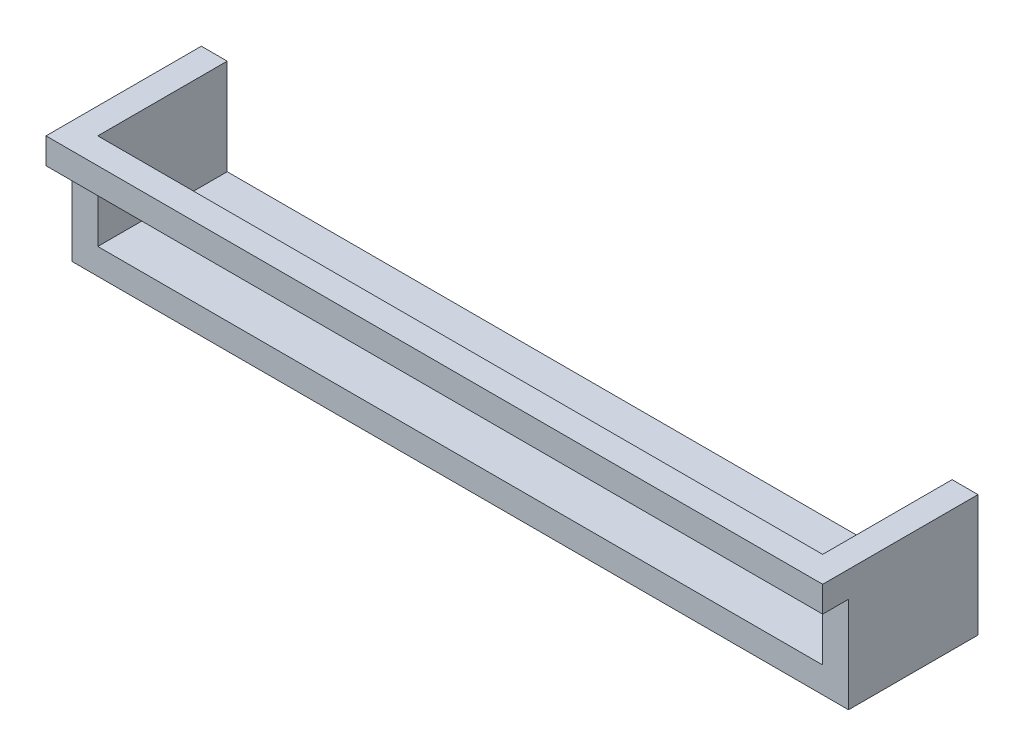
ISO-10303-21;
HEADER;
FILE_DESCRIPTION(('STEP AP214'),'2;1');
FILE_NAME('part.step','',(''),(''),'','','');
FILE_SCHEMA(('AUTOMOTIVE_DESIGN { 1 0 10303 214 1 1 1 1 }'));
ENDSEC;
DATA;
#1=APPLICATION_CONTEXT('core data for automotive mechanical design processes');
#2=APPLICATION_PROTOCOL_DEFINITION('international standard','automotive_design',2000,#1);
#3=PRODUCT_CONTEXT('',#1,'mechanical');
#4=PRODUCT('Part','Part','',(#3));
#5=PRODUCT_RELATED_PRODUCT_CATEGORY('part','',(#4));
#6=PRODUCT_DEFINITION_FORMATION('','',#4);
#7=PRODUCT_DEFINITION_CONTEXT('part definition',#1,'design');
#8=PRODUCT_DEFINITION('design','',#6,#7);
#9=PRODUCT_DEFINITION_SHAPE('','',#8);
#10=(LENGTH_UNIT() NAMED_UNIT(*) SI_UNIT(.MILLI.,.METRE.));
#11=(NAMED_UNIT(*) PLANE_ANGLE_UNIT() SI_UNIT($,.RADIAN.));
#12=(NAMED_UNIT(*) SI_UNIT($,.STERADIAN.) SOLID_ANGLE_UNIT());
#13=UNCERTAINTY_MEASURE_WITH_UNIT(LENGTH_MEASURE(1.E-05),#10,'distance_accuracy_value','');
#14=(GEOMETRIC_REPRESENTATION_CONTEXT(3) GLOBAL_UNCERTAINTY_ASSIGNED_CONTEXT((#13)) GLOBAL_UNIT_ASSIGNED_CONTEXT((#10,
#11,#12)) REPRESENTATION_CONTEXT('',''));
#15=CARTESIAN_POINT('',(0.,0.,0.));
#16=DIRECTION('',(0.,0.,1.));
#17=DIRECTION('',(1.,0.,0.));
#18=AXIS2_PLACEMENT_3D('',#15,#16,#17);
#19=CARTESIAN_POINT('',(-300.,20.,50.0000000000001));
#20=DIRECTION('',(0.,0.,-1.));
#21=DIRECTION('',(-1.,0.,0.));
#22=AXIS2_PLACEMENT_3D('',#19,#20,#21);
#23=PLANE('',#22);
#24=DIRECTION('',(1.,0.,0.));
#25=VECTOR('',#24,1.);
#26=CARTESIAN_POINT('',(-300.,74.,49.9999999999999));
#27=LINE('',#26,#25);
#28=CARTESIAN_POINT('',(-300.,74.,50.0000000000001));
#29=VERTEX_POINT('',#28);
#30=CARTESIAN_POINT('',(-280.,74.,49.9999999999999));
#31=VERTEX_POINT('',#30);
#32=EDGE_CURVE('E49',#29,#31,#27,.T.);
#33=ORIENTED_EDGE('',*,*,#32,.F.);
#34=DIRECTION('',(0.,-1.,0.));
#35=VECTOR('',#34,1.);
#36=CARTESIAN_POINT('',(-300.,20.,50.0000000000001));
#37=LINE('',#36,#35);
#38=CARTESIAN_POINT('',(-300.,0.,50.0000000000001));
#39=VERTEX_POINT('',#38);
#40=EDGE_CURVE('E43',#29,#39,#37,.T.);
#41=ORIENTED_EDGE('',*,*,#40,.T.);
#42=DIRECTION('',(1.,0.,0.));
#43=VECTOR('',#42,1.);
#44=CARTESIAN_POINT('',(-300.,0.,50.0000000000001));
#45=LINE('',#44,#43);
#46=CARTESIAN_POINT('',(300.,0.,49.9999999999999));
#47=VERTEX_POINT('',#46);
#48=EDGE_CURVE('E198',#39,#47,#45,.T.);
#49=ORIENTED_EDGE('',*,*,#48,.T.);
#50=DIRECTION('',(0.,-1.,0.));
#51=VECTOR('',#50,1.);
#52=CARTESIAN_POINT('',(300.,20.,49.9999999999999));
#53=LINE('',#52,#51);
#54=CARTESIAN_POINT('',(300.,74.,49.9999999999999));
#55=VERTEX_POINT('',#54);
#56=EDGE_CURVE('E206',#55,#47,#53,.T.);
#57=ORIENTED_EDGE('',*,*,#56,.F.);
#58=CARTESIAN_POINT('',(280.,74.,49.9999999999999));
#59=VERTEX_POINT('',#58);
#60=EDGE_CURVE('E11',#59,#55,#27,.T.);
#61=ORIENTED_EDGE('',*,*,#60,.F.);
#62=DIRECTION('',(0.,-1.,0.));
#63=VECTOR('',#62,1.);
#64=CARTESIAN_POINT('',(280.,94.,49.9999999999999));
#65=LINE('',#64,#63);
#66=CARTESIAN_POINT('',(280.,20.,49.9999999999999));
#67=VERTEX_POINT('',#66);
#68=EDGE_CURVE('E134',#59,#67,#65,.T.);
#69=ORIENTED_EDGE('',*,*,#68,.T.);
#70=DIRECTION('',(1.,0.,0.));
#71=VECTOR('',#70,1.);
#72=CARTESIAN_POINT('',(-300.,20.,50.0000000000001));
#73=LINE('',#72,#71);
#74=CARTESIAN_POINT('',(-280.,20.,50.0000000000001));
#75=VERTEX_POINT('',#74);
#76=EDGE_CURVE('E189',#75,#67,#73,.T.);
#77=ORIENTED_EDGE('',*,*,#76,.F.);
#78=DIRECTION('',(0.,-1.,0.));
#79=VECTOR('',#78,1.);
#80=CARTESIAN_POINT('',(-280.,94.,50.0000000000001));
#81=LINE('',#80,#79);
#82=EDGE_CURVE('E173',#31,#75,#81,.T.);
#83=ORIENTED_EDGE('',*,*,#82,.F.);
#84=EDGE_LOOP('',(#33,#41,#49,#57,#61,#69,#77,#83));
#85=FACE_BOUND('',#84,.T.);
#86=ADVANCED_FACE('F39',(#85),#23,.F.);
#87=CARTESIAN_POINT('',(0.,20.,0.));
#88=DIRECTION('',(0.,1.,0.));
#89=DIRECTION('',(0.,0.,1.));
#90=AXIS2_PLACEMENT_3D('',#87,#88,#89);
#91=PLANE('',#90);
#92=DIRECTION('',(-1.,0.,0.));
#93=VECTOR('',#92,1.);
#94=CARTESIAN_POINT('',(300.,20.,-50.0000000000001));
#95=LINE('',#94,#93);
#96=CARTESIAN_POINT('',(280.,20.,-50.0000000000001));
#97=VERTEX_POINT('',#96);
#98=CARTESIAN_POINT('',(-280.,20.,-49.9999999999999));
#99=VERTEX_POINT('',#98);
#100=EDGE_CURVE('E192',#97,#99,#95,.T.);
#101=ORIENTED_EDGE('',*,*,#100,.T.);
#102=DIRECTION('',(0.,0.,-1.));
#103=VECTOR('',#102,1.);
#104=CARTESIAN_POINT('',(-280.,20.,0.));
#105=LINE('',#104,#103);
#106=EDGE_CURVE('E160',#75,#99,#105,.T.);
#107=ORIENTED_EDGE('',*,*,#106,.F.);
#108=ORIENTED_EDGE('',*,*,#76,.T.);
#109=DIRECTION('',(0.,0.,1.));
#110=VECTOR('',#109,1.);
#111=CARTESIAN_POINT('',(280.,20.,0.));
#112=LINE('',#111,#110);
#113=EDGE_CURVE('E176',#97,#67,#112,.T.);
#114=ORIENTED_EDGE('',*,*,#113,.F.);
#115=EDGE_LOOP('',(#101,#107,#108,#114));
#116=FACE_BOUND('',#115,.T.);
#117=ADVANCED_FACE('F235',(#116),#91,.T.);
#118=CARTESIAN_POINT('',(-300.,20.,-49.9999999999999));
#119=DIRECTION('',(1.,0.,0.));
#120=DIRECTION('',(0.,0.,-1.));
#121=AXIS2_PLACEMENT_3D('',#118,#119,#120);
#122=PLANE('',#121);
#123=DIRECTION('',(0.,0.,1.));
#124=VECTOR('',#123,1.);
#125=CARTESIAN_POINT('',(-300.,0.,-49.9999999999999));
#126=LINE('',#125,#124);
#127=CARTESIAN_POINT('',(-300.,0.,-49.9999999999999));
#128=VERTEX_POINT('',#127);
#129=EDGE_CURVE('E188',#128,#39,#126,.T.);
#130=ORIENTED_EDGE('',*,*,#129,.T.);
#131=ORIENTED_EDGE('',*,*,#40,.F.);
#132=DIRECTION('',(0.,0.,-1.));
#133=VECTOR('',#132,1.);
#134=CARTESIAN_POINT('',(-300.,74.,69.9999999999999));
#135=LINE('',#134,#133);
#136=CARTESIAN_POINT('',(-300.,74.,69.9999999999999));
#137=VERTEX_POINT('',#136);
#138=EDGE_CURVE('E147',#137,#29,#135,.T.);
#139=ORIENTED_EDGE('',*,*,#138,.F.);
#140=DIRECTION('',(0.,-1.,0.));
#141=VECTOR('',#140,1.);
#142=CARTESIAN_POINT('',(-300.,94.,69.9999999999999));
#143=LINE('',#142,#141);
#144=CARTESIAN_POINT('',(-300.,94.,69.9999999999999));
#145=VERTEX_POINT('',#144);
#146=EDGE_CURVE('E152',#145,#137,#143,.T.);
#147=ORIENTED_EDGE('',*,*,#146,.F.);
#148=DIRECTION('',(0.,0.,1.));
#149=VECTOR('',#148,1.);
#150=CARTESIAN_POINT('',(-300.,94.,0.));
#151=LINE('',#150,#149);
#152=CARTESIAN_POINT('',(-300.,94.,-49.9999999999999));
#153=VERTEX_POINT('',#152);
#154=EDGE_CURVE('E142',#153,#145,#151,.T.);
#155=ORIENTED_EDGE('',*,*,#154,.F.);
#156=DIRECTION('',(0.,-1.,0.));
#157=VECTOR('',#156,1.);
#158=CARTESIAN_POINT('',(-300.,20.,-49.9999999999999));
#159=LINE('',#158,#157);
#160=EDGE_CURVE('E195',#153,#128,#159,.T.);
#161=ORIENTED_EDGE('',*,*,#160,.T.);
#162=EDGE_LOOP('',(#130,#131,#139,#147,#155,#161));
#163=FACE_BOUND('',#162,.T.);
#164=ADVANCED_FACE('F41',(#163),#122,.F.);
#165=CARTESIAN_POINT('',(300.,20.,49.9999999999999));
#166=DIRECTION('',(-1.,0.,0.));
#167=DIRECTION('',(0.,0.,1.));
#168=AXIS2_PLACEMENT_3D('',#165,#166,#167);
#169=PLANE('',#168);
#170=DIRECTION('',(0.,0.,-1.));
#171=VECTOR('',#170,1.);
#172=CARTESIAN_POINT('',(300.,0.,49.9999999999999));
#173=LINE('',#172,#171);
#174=CARTESIAN_POINT('',(300.,0.,-50.0000000000001));
#175=VERTEX_POINT('',#174);
#176=EDGE_CURVE('E201',#47,#175,#173,.T.);
#177=ORIENTED_EDGE('',*,*,#176,.T.);
#178=DIRECTION('',(0.,-1.,0.));
#179=VECTOR('',#178,1.);
#180=CARTESIAN_POINT('',(300.,20.,-50.0000000000001));
#181=LINE('',#180,#179);
#182=CARTESIAN_POINT('',(300.,94.,-50.0000000000001));
#183=VERTEX_POINT('',#182);
#184=EDGE_CURVE('E130',#183,#175,#181,.T.);
#185=ORIENTED_EDGE('',*,*,#184,.F.);
#186=DIRECTION('',(0.,0.,-1.));
#187=VECTOR('',#186,1.);
#188=CARTESIAN_POINT('',(300.,94.,0.));
#189=LINE('',#188,#187);
#190=CARTESIAN_POINT('',(300.,94.,69.9999999999999));
#191=VERTEX_POINT('',#190);
#192=EDGE_CURVE('E122',#191,#183,#189,.T.);
#193=ORIENTED_EDGE('',*,*,#192,.F.);
#194=DIRECTION('',(0.,-1.,0.));
#195=VECTOR('',#194,1.);
#196=CARTESIAN_POINT('',(300.,94.,69.9999999999999));
#197=LINE('',#196,#195);
#198=CARTESIAN_POINT('',(300.,74.,69.9999999999999));
#199=VERTEX_POINT('',#198);
#200=EDGE_CURVE('E127',#191,#199,#197,.T.);
#201=ORIENTED_EDGE('',*,*,#200,.T.);
#202=DIRECTION('',(0.,0.,-1.));
#203=VECTOR('',#202,1.);
#204=CARTESIAN_POINT('',(300.,74.,69.9999999999999));
#205=LINE('',#204,#203);
#206=EDGE_CURVE('E150',#199,#55,#205,.T.);
#207=ORIENTED_EDGE('',*,*,#206,.T.);
#208=ORIENTED_EDGE('',*,*,#56,.T.);
#209=EDGE_LOOP('',(#177,#185,#193,#201,#207,#208));
#210=FACE_BOUND('',#209,.T.);
#211=ADVANCED_FACE('F124',(#210),#169,.F.);
#212=CARTESIAN_POINT('',(300.,20.,-50.0000000000001));
#213=DIRECTION('',(0.,0.,1.));
#214=DIRECTION('',(1.,0.,0.));
#215=AXIS2_PLACEMENT_3D('',#212,#213,#214);
#216=PLANE('',#215);
#217=DIRECTION('',(-1.,0.,0.));
#218=VECTOR('',#217,1.);
#219=CARTESIAN_POINT('',(300.,0.,-50.0000000000001));
#220=LINE('',#219,#218);
#221=EDGE_CURVE('E193',#175,#128,#220,.T.);
#222=ORIENTED_EDGE('',*,*,#221,.T.);
#223=ORIENTED_EDGE('',*,*,#160,.F.);
#224=DIRECTION('',(-1.,0.,0.));
#225=VECTOR('',#224,1.);
#226=CARTESIAN_POINT('',(0.,94.,-50.));
#227=LINE('',#226,#225);
#228=CARTESIAN_POINT('',(-280.,94.,-49.9999999999999));
#229=VERTEX_POINT('',#228);
#230=EDGE_CURVE('E165',#229,#153,#227,.T.);
#231=ORIENTED_EDGE('',*,*,#230,.F.);
#232=DIRECTION('',(0.,-1.,0.));
#233=VECTOR('',#232,1.);
#234=CARTESIAN_POINT('',(-280.,94.,-49.9999999999999));
#235=LINE('',#234,#233);
#236=EDGE_CURVE('E168',#229,#99,#235,.T.);
#237=ORIENTED_EDGE('',*,*,#236,.T.);
#238=ORIENTED_EDGE('',*,*,#100,.F.);
#239=DIRECTION('',(0.,-1.,0.));
#240=VECTOR('',#239,1.);
#241=CARTESIAN_POINT('',(280.,94.,-50.0000000000001));
#242=LINE('',#241,#240);
#243=CARTESIAN_POINT('',(280.,94.,-50.0000000000001));
#244=VERTEX_POINT('',#243);
#245=EDGE_CURVE('E185',#244,#97,#242,.T.);
#246=ORIENTED_EDGE('',*,*,#245,.F.);
#247=DIRECTION('',(-1.,0.,0.));
#248=VECTOR('',#247,1.);
#249=CARTESIAN_POINT('',(0.,94.,-50.));
#250=LINE('',#249,#248);
#251=EDGE_CURVE('E177',#183,#244,#250,.T.);
#252=ORIENTED_EDGE('',*,*,#251,.F.);
#253=ORIENTED_EDGE('',*,*,#184,.T.);
#254=EDGE_LOOP('',(#222,#223,#231,#237,#238,#246,#252,#253));
#255=FACE_BOUND('',#254,.T.);
#256=ADVANCED_FACE('F217',(#255),#216,.F.);
#257=CARTESIAN_POINT('',(0.,0.,0.));
#258=DIRECTION('',(0.,1.,0.));
#259=DIRECTION('',(0.,0.,1.));
#260=AXIS2_PLACEMENT_3D('',#257,#258,#259);
#261=PLANE('',#260);
#262=ORIENTED_EDGE('',*,*,#129,.F.);
#263=ORIENTED_EDGE('',*,*,#221,.F.);
#264=ORIENTED_EDGE('',*,*,#176,.F.);
#265=ORIENTED_EDGE('',*,*,#48,.F.);
#266=EDGE_LOOP('',(#262,#263,#264,#265));
#267=FACE_BOUND('',#266,.T.);
#268=ADVANCED_FACE('F213',(#267),#261,.F.);
#269=CARTESIAN_POINT('',(280.,94.,0.));
#270=DIRECTION('',(1.,0.,0.));
#271=DIRECTION('',(0.,0.,-1.));
#272=AXIS2_PLACEMENT_3D('',#269,#270,#271);
#273=PLANE('',#272);
#274=ORIENTED_EDGE('',*,*,#113,.T.);
#275=ORIENTED_EDGE('',*,*,#68,.F.);
#276=CARTESIAN_POINT('',(280.,94.,49.9999999999999));
#277=VERTEX_POINT('',#276);
#278=EDGE_CURVE('E182',#277,#59,#65,.T.);
#279=ORIENTED_EDGE('',*,*,#278,.F.);
#280=DIRECTION('',(0.,0.,1.));
#281=VECTOR('',#280,1.);
#282=CARTESIAN_POINT('',(280.,94.,0.));
#283=LINE('',#282,#281);
#284=EDGE_CURVE('E135',#244,#277,#283,.T.);
#285=ORIENTED_EDGE('',*,*,#284,.F.);
#286=ORIENTED_EDGE('',*,*,#245,.T.);
#287=EDGE_LOOP('',(#274,#275,#279,#285,#286));
#288=FACE_BOUND('',#287,.T.);
#289=ADVANCED_FACE('F228',(#288),#273,.F.);
#290=CARTESIAN_POINT('',(0.,94.,0.));
#291=DIRECTION('',(0.,1.,0.));
#292=DIRECTION('',(0.,0.,1.));
#293=AXIS2_PLACEMENT_3D('',#290,#291,#292);
#294=PLANE('',#293);
#295=ORIENTED_EDGE('',*,*,#251,.T.);
#296=ORIENTED_EDGE('',*,*,#284,.T.);
#297=DIRECTION('',(1.,0.,0.));
#298=VECTOR('',#297,1.);
#299=CARTESIAN_POINT('',(-300.,94.,49.9999999999999));
#300=LINE('',#299,#298);
#301=CARTESIAN_POINT('',(-280.,94.,50.0000000000001));
#302=VERTEX_POINT('',#301);
#303=EDGE_CURVE('E158',#302,#277,#300,.T.);
#304=ORIENTED_EDGE('',*,*,#303,.F.);
#305=DIRECTION('',(0.,0.,-1.));
#306=VECTOR('',#305,1.);
#307=CARTESIAN_POINT('',(-280.,94.,0.));
#308=LINE('',#307,#306);
#309=EDGE_CURVE('E163',#302,#229,#308,.T.);
#310=ORIENTED_EDGE('',*,*,#309,.T.);
#311=ORIENTED_EDGE('',*,*,#230,.T.);
#312=ORIENTED_EDGE('',*,*,#154,.T.);
#313=DIRECTION('',(1.,0.,0.));
#314=VECTOR('',#313,1.);
#315=CARTESIAN_POINT('',(-300.,94.,69.9999999999999));
#316=LINE('',#315,#314);
#317=EDGE_CURVE('E138',#145,#191,#316,.T.);
#318=ORIENTED_EDGE('',*,*,#317,.T.);
#319=ORIENTED_EDGE('',*,*,#192,.T.);
#320=EDGE_LOOP('',(#295,#296,#304,#310,#311,#312,#318,#319));
#321=FACE_BOUND('',#320,.T.);
#322=ADVANCED_FACE('F139',(#321),#294,.T.);
#323=CARTESIAN_POINT('',(-280.,94.,0.));
#324=DIRECTION('',(-1.,0.,0.));
#325=DIRECTION('',(0.,0.,1.));
#326=AXIS2_PLACEMENT_3D('',#323,#324,#325);
#327=PLANE('',#326);
#328=ORIENTED_EDGE('',*,*,#106,.T.);
#329=ORIENTED_EDGE('',*,*,#236,.F.);
#330=ORIENTED_EDGE('',*,*,#309,.F.);
#331=EDGE_CURVE('E174',#302,#31,#81,.T.);
#332=ORIENTED_EDGE('',*,*,#331,.T.);
#333=ORIENTED_EDGE('',*,*,#82,.T.);
#334=EDGE_LOOP('',(#328,#329,#330,#332,#333));
#335=FACE_BOUND('',#334,.T.);
#336=ADVANCED_FACE('F222',(#335),#327,.F.);
#337=CARTESIAN_POINT('',(-300.,74.,49.9999999999999));
#338=DIRECTION('',(0.,0.,-1.));
#339=DIRECTION('',(0.,1.,0.));
#340=AXIS2_PLACEMENT_3D('',#337,#338,#339);
#341=PLANE('',#340);
#342=ORIENTED_EDGE('',*,*,#303,.T.);
#343=ORIENTED_EDGE('',*,*,#278,.T.);
#344=EDGE_CURVE('E50',#31,#59,#27,.T.);
#345=ORIENTED_EDGE('',*,*,#344,.F.);
#346=ORIENTED_EDGE('',*,*,#331,.F.);
#347=EDGE_LOOP('',(#342,#343,#345,#346));
#348=FACE_BOUND('',#347,.T.);
#349=ADVANCED_FACE('F233',(#348),#341,.T.);
#350=CARTESIAN_POINT('',(-300.,74.,69.9999999999999));
#351=DIRECTION('',(0.,-1.,0.));
#352=DIRECTION('',(0.,0.,-1.));
#353=AXIS2_PLACEMENT_3D('',#350,#351,#352);
#354=PLANE('',#353);
#355=ORIENTED_EDGE('',*,*,#32,.T.);
#356=ORIENTED_EDGE('',*,*,#344,.T.);
#357=ORIENTED_EDGE('',*,*,#60,.T.);
#358=ORIENTED_EDGE('',*,*,#206,.F.);
#359=DIRECTION('',(1.,0.,0.));
#360=VECTOR('',#359,1.);
#361=CARTESIAN_POINT('',(-300.,74.,69.9999999999999));
#362=LINE('',#361,#360);
#363=EDGE_CURVE('E146',#137,#199,#362,.T.);
#364=ORIENTED_EDGE('',*,*,#363,.F.);
#365=ORIENTED_EDGE('',*,*,#138,.T.);
#366=EDGE_LOOP('',(#355,#356,#357,#358,#364,#365));
#367=FACE_BOUND('',#366,.T.);
#368=ADVANCED_FACE('F285',(#367),#354,.T.);
#369=CARTESIAN_POINT('',(-300.,94.,69.9999999999999));
#370=DIRECTION('',(0.,0.,1.));
#371=DIRECTION('',(1.,0.,0.));
#372=AXIS2_PLACEMENT_3D('',#369,#370,#371);
#373=PLANE('',#372);
#374=ORIENTED_EDGE('',*,*,#363,.T.);
#375=ORIENTED_EDGE('',*,*,#200,.F.);
#376=ORIENTED_EDGE('',*,*,#317,.F.);
#377=ORIENTED_EDGE('',*,*,#146,.T.);
#378=EDGE_LOOP('',(#374,#375,#376,#377));
#379=FACE_BOUND('',#378,.T.);
#380=ADVANCED_FACE('F149',(#379),#373,.T.);
#381=CLOSED_SHELL('',(#86,#117,#164,#211,#256,#268,#289,#322,#336,#349,#368,#380));
#382=MANIFOLD_SOLID_BREP('B2',#381);
#383=ADVANCED_BREP_SHAPE_REPRESENTATION('',(#18,#382),#14);
#384=SHAPE_DEFINITION_REPRESENTATION(#9,#383);
ENDSEC;
END-ISO-10303-21;
